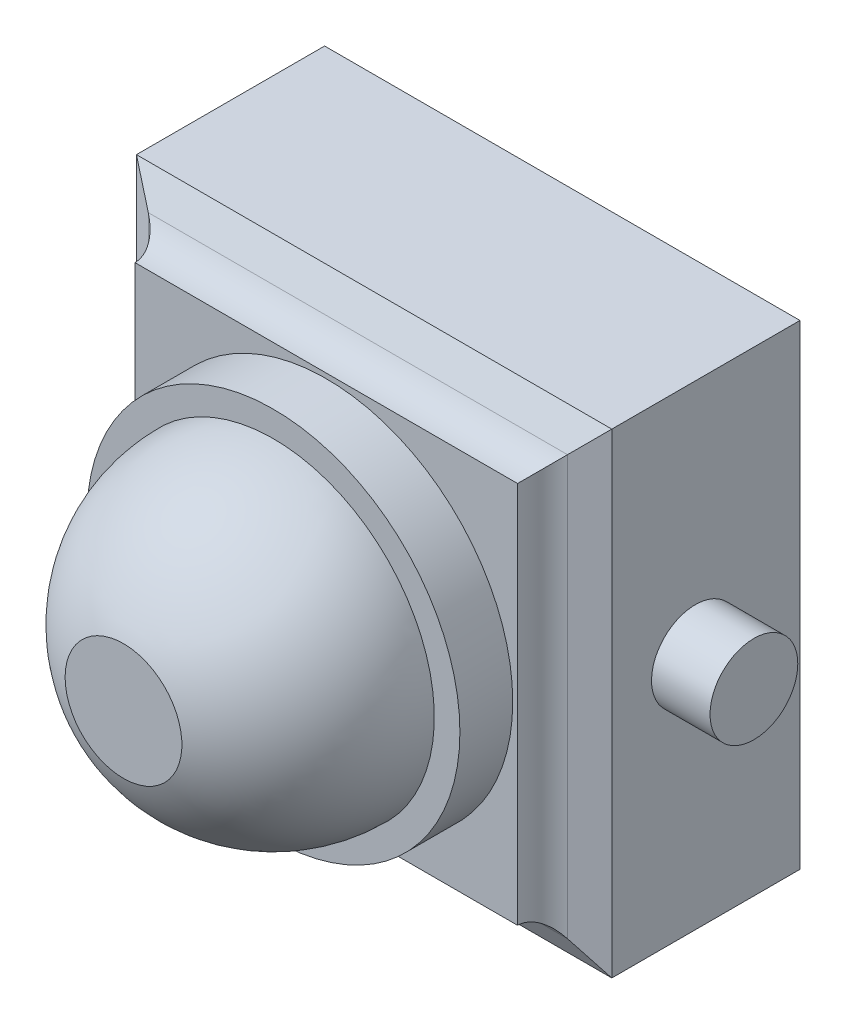
ISO-10303-21;
HEADER;
FILE_DESCRIPTION(('STEP AP214'),'2;1');
FILE_NAME('part.step','',(''),(''),'','','');
FILE_SCHEMA(('AUTOMOTIVE_DESIGN { 1 0 10303 214 1 1 1 1 }'));
ENDSEC;
DATA;
#1=APPLICATION_CONTEXT('core data for automotive mechanical design processes');
#2=APPLICATION_PROTOCOL_DEFINITION('international standard','automotive_design',2000,#1);
#3=PRODUCT_CONTEXT('',#1,'mechanical');
#4=PRODUCT('Part','Part','',(#3));
#5=PRODUCT_RELATED_PRODUCT_CATEGORY('part','',(#4));
#6=PRODUCT_DEFINITION_FORMATION('','',#4);
#7=PRODUCT_DEFINITION_CONTEXT('part definition',#1,'design');
#8=PRODUCT_DEFINITION('design','',#6,#7);
#9=PRODUCT_DEFINITION_SHAPE('','',#8);
#10=(LENGTH_UNIT() NAMED_UNIT(*) SI_UNIT(.MILLI.,.METRE.));
#11=(NAMED_UNIT(*) PLANE_ANGLE_UNIT() SI_UNIT($,.RADIAN.));
#12=(NAMED_UNIT(*) SI_UNIT($,.STERADIAN.) SOLID_ANGLE_UNIT());
#13=UNCERTAINTY_MEASURE_WITH_UNIT(LENGTH_MEASURE(1.E-05),#10,'distance_accuracy_value','');
#14=(GEOMETRIC_REPRESENTATION_CONTEXT(3) GLOBAL_UNCERTAINTY_ASSIGNED_CONTEXT((#13)) GLOBAL_UNIT_ASSIGNED_CONTEXT((#10,
#11,#12)) REPRESENTATION_CONTEXT('',''));
#15=CARTESIAN_POINT('',(0.,0.,0.));
#16=DIRECTION('',(0.,0.,1.));
#17=DIRECTION('',(1.,0.,0.));
#18=AXIS2_PLACEMENT_3D('',#15,#16,#17);
#19=CARTESIAN_POINT('',(0.,0.,39.5));
#20=DIRECTION('',(0.,1.,0.));
#21=DIRECTION('',(1.,0.,0.));
#22=AXIS2_PLACEMENT_3D('',#19,#20,#21);
#23=SPHERICAL_SURFACE('',#22,22.);
#24=CARTESIAN_POINT('',(0.,0.,39.5));
#25=DIRECTION('',(0.,0.,-1.));
#26=DIRECTION('',(-1.,0.,0.));
#27=AXIS2_PLACEMENT_3D('',#24,#25,#26);
#28=SPHERICAL_SURFACE('',#27,22.);
#29=CARTESIAN_POINT('',(0.,0.,60.));
#30=DIRECTION('',(0.,0.,-1.));
#31=DIRECTION('',(-1.,0.,0.));
#32=AXIS2_PLACEMENT_3D('',#29,#30,#31);
#33=CIRCLE('',#32,7.98435971133568);
#34=CARTESIAN_POINT('',(-7.98435971133567,0.,60.));
#35=VERTEX_POINT('',#34);
#36=EDGE_CURVE('E49',#35,#35,#33,.F.);
#37=ORIENTED_EDGE('',*,*,#36,.F.);
#38=EDGE_LOOP('',(#37));
#39=FACE_BOUND('',#38,.T.);
#40=CARTESIAN_POINT('',(0.,0.,39.5));
#41=DIRECTION('',(0.,0.,-1.));
#42=DIRECTION('',(-1.,0.,0.));
#43=AXIS2_PLACEMENT_3D('',#40,#41,#42);
#44=CIRCLE('',#43,22.);
#45=CARTESIAN_POINT('',(-22.,0.,39.4999999999999));
#46=VERTEX_POINT('',#45);
#47=EDGE_CURVE('E11',#46,#46,#44,.F.);
#48=ORIENTED_EDGE('',*,*,#47,.T.);
#49=EDGE_LOOP('',(#48));
#50=FACE_BOUND('',#49,.T.);
#51=ADVANCED_FACE('F46',(#39,#50),#28,.T.);
#52=CARTESIAN_POINT('',(0.,0.,39.5));
#53=DIRECTION('',(0.,0.,-1.));
#54=DIRECTION('',(-1.,0.,0.));
#55=AXIS2_PLACEMENT_3D('',#52,#53,#54);
#56=PLANE('',#55);
#57=ORIENTED_EDGE('',*,*,#47,.F.);
#58=EDGE_LOOP('',(#57));
#59=FACE_BOUND('',#58,.T.);
#60=ADVANCED_FACE('F61',(#59),#56,.T.);
#61=CARTESIAN_POINT('',(-9.99999999999998,-32.5,60.));
#62=DIRECTION('',(0.,0.,-1.));
#63=DIRECTION('',(-1.,0.,0.));
#64=AXIS2_PLACEMENT_3D('',#61,#62,#63);
#65=PLANE('',#64);
#66=ORIENTED_EDGE('',*,*,#36,.T.);
#67=EDGE_LOOP('',(#66));
#68=FACE_BOUND('',#67,.T.);
#69=ADVANCED_FACE('F58',(#68),#65,.F.);
#70=CLOSED_SHELL('',(#51,#60,#69));
#71=MANIFOLD_SOLID_BREP('B2',#70);
#72=CARTESIAN_POINT('',(32.5,32.5,39.5));
#73=DIRECTION('',(-1.,0.,0.));
#74=DIRECTION('',(0.,-1.,0.));
#75=AXIS2_PLACEMENT_3D('',#72,#73,#74);
#76=PLANE('',#75);
#77=CARTESIAN_POINT('',(32.5,0.,14.3));
#78=DIRECTION('',(-1.,0.,0.));
#79=DIRECTION('',(0.,-1.,0.));
#80=AXIS2_PLACEMENT_3D('',#77,#78,#79);
#81=CIRCLE('',#80,6.);
#82=CARTESIAN_POINT('',(32.5,-6.,14.3));
#83=VERTEX_POINT('',#82);
#84=EDGE_CURVE('E44',#83,#83,#81,.F.);
#85=ORIENTED_EDGE('',*,*,#84,.F.);
#86=EDGE_LOOP('',(#85));
#87=FACE_BOUND('',#86,.T.);
#88=DIRECTION('',(0.,1.,0.));
#89=VECTOR('',#88,1.);
#90=CARTESIAN_POINT('',(32.5000000000001,-32.501,25.73));
#91=LINE('',#90,#89);
#92=CARTESIAN_POINT('',(32.5,-32.5,25.73));
#93=VERTEX_POINT('',#92);
#94=CARTESIAN_POINT('',(32.4999999999999,32.5,25.73));
#95=VERTEX_POINT('',#94);
#96=EDGE_CURVE('E241',#93,#95,#91,.T.);
#97=ORIENTED_EDGE('',*,*,#96,.F.);
#98=DIRECTION('',(0.,0.,-1.));
#99=VECTOR('',#98,1.);
#100=CARTESIAN_POINT('',(32.5,-32.5,39.5));
#101=LINE('',#100,#99);
#102=CARTESIAN_POINT('',(32.5,-32.5,0.));
#103=VERTEX_POINT('',#102);
#104=EDGE_CURVE('E103',#93,#103,#101,.T.);
#105=ORIENTED_EDGE('',*,*,#104,.T.);
#106=DIRECTION('',(0.,1.,0.));
#107=VECTOR('',#106,1.);
#108=CARTESIAN_POINT('',(32.5,32.5,0.));
#109=LINE('',#108,#107);
#110=CARTESIAN_POINT('',(32.5,32.5,0.));
#111=VERTEX_POINT('',#110);
#112=EDGE_CURVE('E214',#103,#111,#109,.T.);
#113=ORIENTED_EDGE('',*,*,#112,.T.);
#114=DIRECTION('',(0.,0.,-1.));
#115=VECTOR('',#114,1.);
#116=CARTESIAN_POINT('',(32.5,32.5,39.5));
#117=LINE('',#116,#115);
#118=EDGE_CURVE('E96',#95,#111,#117,.T.);
#119=ORIENTED_EDGE('',*,*,#118,.F.);
#120=EDGE_LOOP('',(#97,#105,#113,#119));
#121=FACE_BOUND('',#120,.T.);
#122=ADVANCED_FACE('F89',(#87,#121),#76,.F.);
#123=CARTESIAN_POINT('',(-32.5,32.5,39.5));
#124=DIRECTION('',(1.,0.,0.));
#125=DIRECTION('',(0.,1.,0.));
#126=AXIS2_PLACEMENT_3D('',#123,#124,#125);
#127=PLANE('',#126);
#128=DIRECTION('',(0.,-1.,0.));
#129=VECTOR('',#128,1.);
#130=CARTESIAN_POINT('',(-32.4999999999999,32.5010000000003,25.73));
#131=LINE('',#130,#129);
#132=CARTESIAN_POINT('',(-32.5,32.5,25.73));
#133=VERTEX_POINT('',#132);
#134=CARTESIAN_POINT('',(-32.5,-32.5,25.73));
#135=VERTEX_POINT('',#134);
#136=EDGE_CURVE('E475',#133,#135,#131,.T.);
#137=ORIENTED_EDGE('',*,*,#136,.F.);
#138=DIRECTION('',(0.,0.,-1.));
#139=VECTOR('',#138,1.);
#140=CARTESIAN_POINT('',(-32.5,32.5,39.5));
#141=LINE('',#140,#139);
#142=CARTESIAN_POINT('',(-32.5,32.5,0.));
#143=VERTEX_POINT('',#142);
#144=EDGE_CURVE('E227',#133,#143,#141,.T.);
#145=ORIENTED_EDGE('',*,*,#144,.T.);
#146=DIRECTION('',(0.,-1.,0.));
#147=VECTOR('',#146,1.);
#148=CARTESIAN_POINT('',(-32.5,32.5,0.));
#149=LINE('',#148,#147);
#150=CARTESIAN_POINT('',(-32.5,-32.5,0.));
#151=VERTEX_POINT('',#150);
#152=EDGE_CURVE('E221',#143,#151,#149,.T.);
#153=ORIENTED_EDGE('',*,*,#152,.T.);
#154=DIRECTION('',(0.,0.,-1.));
#155=VECTOR('',#154,1.);
#156=CARTESIAN_POINT('',(-32.5,-32.5,39.5));
#157=LINE('',#156,#155);
#158=EDGE_CURVE('E110',#135,#151,#157,.T.);
#159=ORIENTED_EDGE('',*,*,#158,.F.);
#160=EDGE_LOOP('',(#137,#145,#153,#159));
#161=FACE_BOUND('',#160,.T.);
#162=ADVANCED_FACE('F244',(#161),#127,.F.);
#163=CARTESIAN_POINT('',(-32.501,-31.1602025479538,32.2768915517541));
#164=DIRECTION('',(1.,0.,0.));
#165=DIRECTION('',(0.,0.,-1.));
#166=AXIS2_PLACEMENT_3D('',#163,#164,#165);
#167=CYLINDRICAL_SURFACE('',#166,5.);
#168=DIRECTION('',(1.,0.,0.));
#169=VECTOR('',#168,1.);
#170=CARTESIAN_POINT('',(-32.501,-28.6603239717094,27.9466944310639));
#171=LINE('',#170,#169);
#172=CARTESIAN_POINT('',(-28.6603239717095,-28.6603239717094,27.9466944310639));
#173=VERTEX_POINT('',#172);
#174=CARTESIAN_POINT('',(28.6603239717095,-28.6603239717094,27.9466944310639));
#175=VERTEX_POINT('',#174);
#176=EDGE_CURVE('E184',#173,#175,#171,.T.);
#177=ORIENTED_EDGE('',*,*,#176,.T.);
#178=CARTESIAN_POINT('',(31.1602025479539,-31.1602025479538,32.2768915517541));
#179=DIRECTION('',(0.707106781186546,0.707106781186549,0.));
#180=DIRECTION('',(-0.707106781186549,0.707106781186546,0.));
#181=AXIS2_PLACEMENT_3D('',#178,#179,#180);
#182=ELLIPSE('',#181,7.07106781186549,5.);
#183=CARTESIAN_POINT('',(26.1602025499197,-26.1602025499196,32.2767513448132));
#184=VERTEX_POINT('',#183);
#185=EDGE_CURVE('E182',#184,#175,#182,.F.);
#186=ORIENTED_EDGE('',*,*,#185,.F.);
#187=DIRECTION('',(1.,0.,0.));
#188=VECTOR('',#187,1.);
#189=CARTESIAN_POINT('',(-32.501,-26.1602025499196,32.2767513448132));
#190=LINE('',#189,#188);
#191=CARTESIAN_POINT('',(-26.1602025499196,-26.1602025499195,32.2767513448132));
#192=VERTEX_POINT('',#191);
#193=EDGE_CURVE('E159',#192,#184,#190,.T.);
#194=ORIENTED_EDGE('',*,*,#193,.F.);
#195=CARTESIAN_POINT('',(-31.1602025479539,-31.1602025479538,32.2768915517541));
#196=DIRECTION('',(-0.707106781186546,0.707106781186549,0.));
#197=DIRECTION('',(0.707106781186549,0.707106781186546,0.));
#198=AXIS2_PLACEMENT_3D('',#195,#196,#197);
#199=ELLIPSE('',#198,7.07106781186549,5.);
#200=EDGE_CURVE('E169',#192,#173,#199,.T.);
#201=ORIENTED_EDGE('',*,*,#200,.T.);
#202=EDGE_LOOP('',(#177,#186,#194,#201));
#203=FACE_BOUND('',#202,.T.);
#204=ADVANCED_FACE('F180',(#203),#167,.F.);
#205=CARTESIAN_POINT('',(-32.501,-28.6603239717094,27.9466944310639));
#206=DIRECTION('',(0.,-0.499975715248886,0.86603942413805));
#207=DIRECTION('',(0.,-0.86603942413805,-0.499975715248886));
#208=AXIS2_PLACEMENT_3D('',#205,#206,#207);
#209=PLANE('',#208);
#210=DIRECTION('',(1.,0.,0.));
#211=VECTOR('',#210,1.);
#212=CARTESIAN_POINT('',(-32.501,-32.5,25.73));
#213=LINE('',#212,#211);
#214=EDGE_CURVE('E189',#135,#93,#213,.T.);
#215=ORIENTED_EDGE('',*,*,#214,.T.);
#216=DIRECTION('',(0.654659726868451,-0.654659726868449,-0.377943493174646));
#217=VECTOR('',#216,1.);
#218=CARTESIAN_POINT('',(30.3063584381368,-30.3063584381367,26.996417530569));
#219=LINE('',#218,#217);
#220=EDGE_CURVE('E488',#175,#93,#219,.T.);
#221=ORIENTED_EDGE('',*,*,#220,.F.);
#222=ORIENTED_EDGE('',*,*,#176,.F.);
#223=DIRECTION('',(-0.654659726868451,-0.654659726868449,-0.377943493174646));
#224=VECTOR('',#223,1.);
#225=CARTESIAN_POINT('',(-30.3063584381368,-30.3063584381367,26.996417530569));
#226=LINE('',#225,#224);
#227=EDGE_CURVE('E176',#173,#135,#226,.T.);
#228=ORIENTED_EDGE('',*,*,#227,.T.);
#229=EDGE_LOOP('',(#215,#221,#222,#228));
#230=FACE_BOUND('',#229,.T.);
#231=ADVANCED_FACE('F382',(#230),#209,.T.);
#232=CARTESIAN_POINT('',(-32.501,28.6603239717094,27.9466944310639));
#233=DIRECTION('',(0.,-0.499975715248886,-0.86603942413805));
#234=DIRECTION('',(0.,0.86603942413805,-0.499975715248886));
#235=AXIS2_PLACEMENT_3D('',#232,#233,#234);
#236=PLANE('',#235);
#237=DIRECTION('',(-0.654659726868448,-0.654659726868451,0.377943493174647));
#238=VECTOR('',#237,1.);
#239=CARTESIAN_POINT('',(30.3063584381367,30.3063584381368,26.9964175305689));
#240=LINE('',#239,#238);
#241=CARTESIAN_POINT('',(28.6603239717093,28.6603239717094,27.9466944310639));
#242=VERTEX_POINT('',#241);
#243=EDGE_CURVE('E500',#95,#242,#240,.T.);
#244=ORIENTED_EDGE('',*,*,#243,.F.);
#245=DIRECTION('',(1.,0.,0.));
#246=VECTOR('',#245,1.);
#247=CARTESIAN_POINT('',(-32.501,32.5,25.73));
#248=LINE('',#247,#246);
#249=EDGE_CURVE('E236',#133,#95,#248,.T.);
#250=ORIENTED_EDGE('',*,*,#249,.F.);
#251=DIRECTION('',(0.654659726868448,-0.654659726868451,0.377943493174647));
#252=VECTOR('',#251,1.);
#253=CARTESIAN_POINT('',(-30.3063584381367,30.3063584381368,26.9964175305689));
#254=LINE('',#253,#252);
#255=CARTESIAN_POINT('',(-28.6603239717093,28.6603239717094,27.9466944310639));
#256=VERTEX_POINT('',#255);
#257=EDGE_CURVE('E165',#133,#256,#254,.T.);
#258=ORIENTED_EDGE('',*,*,#257,.T.);
#259=DIRECTION('',(1.,0.,0.));
#260=VECTOR('',#259,1.);
#261=CARTESIAN_POINT('',(-32.501,28.6603239717094,27.9466944310639));
#262=LINE('',#261,#260);
#263=EDGE_CURVE('E482',#256,#242,#262,.T.);
#264=ORIENTED_EDGE('',*,*,#263,.T.);
#265=EDGE_LOOP('',(#244,#250,#258,#264));
#266=FACE_BOUND('',#265,.T.);
#267=ADVANCED_FACE('F387',(#266),#236,.F.);
#268=CARTESIAN_POINT('',(-32.501,31.1602025479538,32.2768915517541));
#269=DIRECTION('',(1.,0.,0.));
#270=DIRECTION('',(0.,0.,-1.));
#271=AXIS2_PLACEMENT_3D('',#268,#269,#270);
#272=CYLINDRICAL_SURFACE('',#271,5.);
#273=CARTESIAN_POINT('',(31.1602025479537,31.1602025479538,32.2768915517541));
#274=DIRECTION('',(0.707106781186549,-0.707106781186546,0.));
#275=DIRECTION('',(-0.707106781186546,-0.707106781186549,0.));
#276=AXIS2_PLACEMENT_3D('',#273,#274,#275);
#277=ELLIPSE('',#276,7.07106781186546,5.);
#278=CARTESIAN_POINT('',(26.1602025499195,26.1602025499196,32.2767513448132));
#279=VERTEX_POINT('',#278);
#280=EDGE_CURVE('E489',#242,#279,#277,.F.);
#281=ORIENTED_EDGE('',*,*,#280,.F.);
#282=ORIENTED_EDGE('',*,*,#263,.F.);
#283=CARTESIAN_POINT('',(-31.1602025479537,31.1602025479538,32.2768915517541));
#284=DIRECTION('',(-0.707106781186549,-0.707106781186546,0.));
#285=DIRECTION('',(0.707106781186546,-0.707106781186549,0.));
#286=AXIS2_PLACEMENT_3D('',#283,#284,#285);
#287=ELLIPSE('',#286,7.07106781186546,5.);
#288=CARTESIAN_POINT('',(-26.1602025499195,26.1602025499196,32.2767513448132));
#289=VERTEX_POINT('',#288);
#290=EDGE_CURVE('E478',#256,#289,#287,.T.);
#291=ORIENTED_EDGE('',*,*,#290,.T.);
#292=DIRECTION('',(1.,0.,0.));
#293=VECTOR('',#292,1.);
#294=CARTESIAN_POINT('',(-32.501,26.1602025499196,32.2767513448132));
#295=LINE('',#294,#293);
#296=EDGE_CURVE('E162',#289,#279,#295,.T.);
#297=ORIENTED_EDGE('',*,*,#296,.T.);
#298=EDGE_LOOP('',(#281,#282,#291,#297));
#299=FACE_BOUND('',#298,.T.);
#300=ADVANCED_FACE('F308',(#299),#272,.F.);
#301=CARTESIAN_POINT('',(-32.5,-32.5,39.5));
#302=DIRECTION('',(0.,1.,0.));
#303=DIRECTION('',(0.,0.,1.));
#304=AXIS2_PLACEMENT_3D('',#301,#302,#303);
#305=PLANE('',#304);
#306=ORIENTED_EDGE('',*,*,#214,.F.);
#307=ORIENTED_EDGE('',*,*,#158,.T.);
#308=DIRECTION('',(1.,0.,0.));
#309=VECTOR('',#308,1.);
#310=CARTESIAN_POINT('',(-32.5,-32.5,0.));
#311=LINE('',#310,#309);
#312=EDGE_CURVE('E223',#151,#103,#311,.T.);
#313=ORIENTED_EDGE('',*,*,#312,.T.);
#314=ORIENTED_EDGE('',*,*,#104,.F.);
#315=EDGE_LOOP('',(#306,#307,#313,#314));
#316=FACE_BOUND('',#315,.T.);
#317=ADVANCED_FACE('F306',(#316),#305,.F.);
#318=CARTESIAN_POINT('',(-32.5,32.5,39.5));
#319=DIRECTION('',(0.,-1.,0.));
#320=DIRECTION('',(0.,0.,-1.));
#321=AXIS2_PLACEMENT_3D('',#318,#319,#320);
#322=PLANE('',#321);
#323=ORIENTED_EDGE('',*,*,#144,.F.);
#324=ORIENTED_EDGE('',*,*,#249,.T.);
#325=ORIENTED_EDGE('',*,*,#118,.T.);
#326=DIRECTION('',(-1.,0.,0.));
#327=VECTOR('',#326,1.);
#328=CARTESIAN_POINT('',(-32.5,32.5,0.));
#329=LINE('',#328,#327);
#330=EDGE_CURVE('E218',#111,#143,#329,.T.);
#331=ORIENTED_EDGE('',*,*,#330,.T.);
#332=EDGE_LOOP('',(#323,#324,#325,#331));
#333=FACE_BOUND('',#332,.T.);
#334=ADVANCED_FACE('F233',(#333),#322,.F.);
#335=CARTESIAN_POINT('',(0.,0.,0.));
#336=DIRECTION('',(0.,0.,1.));
#337=DIRECTION('',(1.,0.,0.));
#338=AXIS2_PLACEMENT_3D('',#335,#336,#337);
#339=PLANE('',#338);
#340=CARTESIAN_POINT('',(-24.,18.,0.));
#341=DIRECTION('',(0.,0.,-1.));
#342=DIRECTION('',(1.,0.,0.));
#343=AXIS2_PLACEMENT_3D('',#340,#341,#342);
#344=CIRCLE('',#343,1.5);
#345=CARTESIAN_POINT('',(-22.5,18.,0.));
#346=VERTEX_POINT('',#345);
#347=EDGE_CURVE('E187',#346,#346,#344,.T.);
#348=ORIENTED_EDGE('',*,*,#347,.F.);
#349=EDGE_LOOP('',(#348));
#350=FACE_BOUND('',#349,.T.);
#351=CARTESIAN_POINT('',(24.,18.,0.));
#352=DIRECTION('',(0.,0.,-1.));
#353=DIRECTION('',(-1.,0.,0.));
#354=AXIS2_PLACEMENT_3D('',#351,#352,#353);
#355=CIRCLE('',#354,1.5);
#356=CARTESIAN_POINT('',(22.5,18.,0.));
#357=VERTEX_POINT('',#356);
#358=EDGE_CURVE('E203',#357,#357,#355,.T.);
#359=ORIENTED_EDGE('',*,*,#358,.F.);
#360=EDGE_LOOP('',(#359));
#361=FACE_BOUND('',#360,.T.);
#362=CARTESIAN_POINT('',(24.,-18.,0.));
#363=DIRECTION('',(0.,0.,-1.));
#364=DIRECTION('',(1.,0.,0.));
#365=AXIS2_PLACEMENT_3D('',#362,#363,#364);
#366=CIRCLE('',#365,1.5);
#367=CARTESIAN_POINT('',(25.5,-18.,0.));
#368=VERTEX_POINT('',#367);
#369=EDGE_CURVE('E197',#368,#368,#366,.T.);
#370=ORIENTED_EDGE('',*,*,#369,.F.);
#371=EDGE_LOOP('',(#370));
#372=FACE_BOUND('',#371,.T.);
#373=CARTESIAN_POINT('',(-24.,-18.,0.));
#374=DIRECTION('',(0.,0.,-1.));
#375=DIRECTION('',(-1.,0.,0.));
#376=AXIS2_PLACEMENT_3D('',#373,#374,#375);
#377=CIRCLE('',#376,1.5);
#378=CARTESIAN_POINT('',(-25.5,-18.,0.));
#379=VERTEX_POINT('',#378);
#380=EDGE_CURVE('E196',#379,#379,#377,.T.);
#381=ORIENTED_EDGE('',*,*,#380,.F.);
#382=EDGE_LOOP('',(#381));
#383=FACE_BOUND('',#382,.T.);
#384=ORIENTED_EDGE('',*,*,#112,.F.);
#385=ORIENTED_EDGE('',*,*,#312,.F.);
#386=ORIENTED_EDGE('',*,*,#152,.F.);
#387=ORIENTED_EDGE('',*,*,#330,.F.);
#388=EDGE_LOOP('',(#384,#385,#386,#387));
#389=FACE_BOUND('',#388,.T.);
#390=ADVANCED_FACE('F239',(#350,#361,#372,#383,#389),#339,.F.);
#391=CARTESIAN_POINT('',(-24.,-18.,5.));
#392=DIRECTION('',(0.,0.,-1.));
#393=DIRECTION('',(-1.,0.,0.));
#394=AXIS2_PLACEMENT_3D('',#391,#392,#393);
#395=CYLINDRICAL_SURFACE('',#394,1.5);
#396=CARTESIAN_POINT('',(-24.,-18.,5.));
#397=DIRECTION('',(0.,0.,-1.));
#398=DIRECTION('',(-1.,0.,0.));
#399=AXIS2_PLACEMENT_3D('',#396,#397,#398);
#400=CIRCLE('',#399,1.5);
#401=CARTESIAN_POINT('',(-25.5,-18.,5.));
#402=VERTEX_POINT('',#401);
#403=EDGE_CURVE('E211',#402,#402,#400,.T.);
#404=ORIENTED_EDGE('',*,*,#403,.F.);
#405=EDGE_LOOP('',(#404));
#406=FACE_BOUND('',#405,.T.);
#407=ORIENTED_EDGE('',*,*,#380,.T.);
#408=EDGE_LOOP('',(#407));
#409=FACE_BOUND('',#408,.T.);
#410=ADVANCED_FACE('F293',(#406,#409),#395,.F.);
#411=CARTESIAN_POINT('',(-24.,-18.,5.));
#412=DIRECTION('',(0.,0.,-1.));
#413=DIRECTION('',(-1.,0.,0.));
#414=AXIS2_PLACEMENT_3D('',#411,#412,#413);
#415=PLANE('',#414);
#416=ORIENTED_EDGE('',*,*,#403,.T.);
#417=EDGE_LOOP('',(#416));
#418=FACE_BOUND('',#417,.T.);
#419=ADVANCED_FACE('F279',(#418),#415,.T.);
#420=CARTESIAN_POINT('',(24.,-18.,5.));
#421=DIRECTION('',(0.,0.,-1.));
#422=DIRECTION('',(-1.,0.,0.));
#423=AXIS2_PLACEMENT_3D('',#420,#421,#422);
#424=CYLINDRICAL_SURFACE('',#423,1.5);
#425=CARTESIAN_POINT('',(24.,-18.,5.));
#426=DIRECTION('',(0.,0.,-1.));
#427=DIRECTION('',(1.,0.,0.));
#428=AXIS2_PLACEMENT_3D('',#425,#426,#427);
#429=CIRCLE('',#428,1.5);
#430=CARTESIAN_POINT('',(25.5,-18.,5.));
#431=VERTEX_POINT('',#430);
#432=EDGE_CURVE('E193',#431,#431,#429,.T.);
#433=ORIENTED_EDGE('',*,*,#432,.F.);
#434=EDGE_LOOP('',(#433));
#435=FACE_BOUND('',#434,.T.);
#436=ORIENTED_EDGE('',*,*,#369,.T.);
#437=EDGE_LOOP('',(#436));
#438=FACE_BOUND('',#437,.T.);
#439=ADVANCED_FACE('F275',(#435,#438),#424,.F.);
#440=CARTESIAN_POINT('',(24.,-18.,5.));
#441=DIRECTION('',(0.,0.,1.));
#442=DIRECTION('',(1.,0.,0.));
#443=AXIS2_PLACEMENT_3D('',#440,#441,#442);
#444=PLANE('',#443);
#445=ORIENTED_EDGE('',*,*,#432,.T.);
#446=EDGE_LOOP('',(#445));
#447=FACE_BOUND('',#446,.T.);
#448=ADVANCED_FACE('F271',(#447),#444,.F.);
#449=CARTESIAN_POINT('',(24.,18.,5.));
#450=DIRECTION('',(0.,0.,-1.));
#451=DIRECTION('',(-1.,0.,0.));
#452=AXIS2_PLACEMENT_3D('',#449,#450,#451);
#453=CYLINDRICAL_SURFACE('',#452,1.5);
#454=CARTESIAN_POINT('',(24.,18.,5.));
#455=DIRECTION('',(0.,0.,-1.));
#456=DIRECTION('',(-1.,0.,0.));
#457=AXIS2_PLACEMENT_3D('',#454,#455,#456);
#458=CIRCLE('',#457,1.5);
#459=CARTESIAN_POINT('',(22.5,18.,5.));
#460=VERTEX_POINT('',#459);
#461=EDGE_CURVE('E200',#460,#460,#458,.T.);
#462=ORIENTED_EDGE('',*,*,#461,.F.);
#463=EDGE_LOOP('',(#462));
#464=FACE_BOUND('',#463,.T.);
#465=ORIENTED_EDGE('',*,*,#358,.T.);
#466=EDGE_LOOP('',(#465));
#467=FACE_BOUND('',#466,.T.);
#468=ADVANCED_FACE('F274',(#464,#467),#453,.F.);
#469=CARTESIAN_POINT('',(24.,18.,5.));
#470=DIRECTION('',(0.,0.,-1.));
#471=DIRECTION('',(-1.,0.,0.));
#472=AXIS2_PLACEMENT_3D('',#469,#470,#471);
#473=PLANE('',#472);
#474=ORIENTED_EDGE('',*,*,#461,.T.);
#475=EDGE_LOOP('',(#474));
#476=FACE_BOUND('',#475,.T.);
#477=ADVANCED_FACE('F281',(#476),#473,.T.);
#478=CARTESIAN_POINT('',(-24.,18.,5.));
#479=DIRECTION('',(0.,0.,-1.));
#480=DIRECTION('',(-1.,0.,0.));
#481=AXIS2_PLACEMENT_3D('',#478,#479,#480);
#482=CYLINDRICAL_SURFACE('',#481,1.5);
#483=CARTESIAN_POINT('',(-24.,18.,5.));
#484=DIRECTION('',(0.,0.,-1.));
#485=DIRECTION('',(1.,0.,0.));
#486=AXIS2_PLACEMENT_3D('',#483,#484,#485);
#487=CIRCLE('',#486,1.5);
#488=CARTESIAN_POINT('',(-22.5,18.,5.));
#489=VERTEX_POINT('',#488);
#490=EDGE_CURVE('E206',#489,#489,#487,.T.);
#491=ORIENTED_EDGE('',*,*,#490,.F.);
#492=EDGE_LOOP('',(#491));
#493=FACE_BOUND('',#492,.T.);
#494=ORIENTED_EDGE('',*,*,#347,.T.);
#495=EDGE_LOOP('',(#494));
#496=FACE_BOUND('',#495,.T.);
#497=ADVANCED_FACE('F265',(#493,#496),#482,.F.);
#498=CARTESIAN_POINT('',(-24.,18.,5.));
#499=DIRECTION('',(0.,0.,1.));
#500=DIRECTION('',(1.,0.,0.));
#501=AXIS2_PLACEMENT_3D('',#498,#499,#500);
#502=PLANE('',#501);
#503=ORIENTED_EDGE('',*,*,#490,.T.);
#504=EDGE_LOOP('',(#503));
#505=FACE_BOUND('',#504,.T.);
#506=ADVANCED_FACE('F256',(#505),#502,.F.);
#507=CARTESIAN_POINT('',(40.5,0.,14.3));
#508=DIRECTION('',(-1.,0.,0.));
#509=DIRECTION('',(0.,-1.,0.));
#510=AXIS2_PLACEMENT_3D('',#507,#508,#509);
#511=CYLINDRICAL_SURFACE('',#510,6.);
#512=CARTESIAN_POINT('',(40.5,0.,14.3));
#513=DIRECTION('',(1.,0.,0.));
#514=DIRECTION('',(0.,1.,0.));
#515=AXIS2_PLACEMENT_3D('',#512,#513,#514);
#516=CIRCLE('',#515,6.);
#517=CARTESIAN_POINT('',(40.5,6.00000000000001,14.3));
#518=VERTEX_POINT('',#517);
#519=EDGE_CURVE('E183',#518,#518,#516,.T.);
#520=ORIENTED_EDGE('',*,*,#519,.F.);
#521=EDGE_LOOP('',(#520));
#522=FACE_BOUND('',#521,.T.);
#523=ORIENTED_EDGE('',*,*,#84,.T.);
#524=EDGE_LOOP('',(#523));
#525=FACE_BOUND('',#524,.T.);
#526=ADVANCED_FACE('F253',(#522,#525),#511,.T.);
#527=CARTESIAN_POINT('',(40.5,0.,14.3));
#528=DIRECTION('',(1.,0.,0.));
#529=DIRECTION('',(0.,1.,0.));
#530=AXIS2_PLACEMENT_3D('',#527,#528,#529);
#531=PLANE('',#530);
#532=ORIENTED_EDGE('',*,*,#519,.T.);
#533=EDGE_LOOP('',(#532));
#534=FACE_BOUND('',#533,.T.);
#535=ADVANCED_FACE('F255',(#534),#531,.T.);
#536=CARTESIAN_POINT('',(-31.1602025479537,32.5010000000003,32.2768915517541));
#537=DIRECTION('',(0.,-1.,0.));
#538=DIRECTION('',(1.,0.,0.));
#539=AXIS2_PLACEMENT_3D('',#536,#537,#538);
#540=CYLINDRICAL_SURFACE('',#539,5.);
#541=DIRECTION('',(0.,-1.,0.));
#542=VECTOR('',#541,1.);
#543=CARTESIAN_POINT('',(-28.6603239717093,32.5010000000002,27.9466944310639));
#544=LINE('',#543,#542);
#545=EDGE_CURVE('E166',#256,#173,#544,.T.);
#546=ORIENTED_EDGE('',*,*,#545,.T.);
#547=ORIENTED_EDGE('',*,*,#200,.F.);
#548=DIRECTION('',(0.,-1.,0.));
#549=VECTOR('',#548,1.);
#550=CARTESIAN_POINT('',(-26.1602025499195,32.5010000000002,32.2767513448132));
#551=LINE('',#550,#549);
#552=EDGE_CURVE('E155',#289,#192,#551,.T.);
#553=ORIENTED_EDGE('',*,*,#552,.F.);
#554=ORIENTED_EDGE('',*,*,#290,.F.);
#555=EDGE_LOOP('',(#546,#547,#553,#554));
#556=FACE_BOUND('',#555,.T.);
#557=ADVANCED_FACE('F170',(#556),#540,.F.);
#558=CARTESIAN_POINT('',(-28.6603239717093,32.5010000000002,27.9466944310639));
#559=DIRECTION('',(-0.499975715248886,0.,0.86603942413805));
#560=DIRECTION('',(0.86603942413805,0.,0.499975715248886));
#561=AXIS2_PLACEMENT_3D('',#558,#559,#560);
#562=PLANE('',#561);
#563=ORIENTED_EDGE('',*,*,#136,.T.);
#564=ORIENTED_EDGE('',*,*,#227,.F.);
#565=ORIENTED_EDGE('',*,*,#545,.F.);
#566=ORIENTED_EDGE('',*,*,#257,.F.);
#567=EDGE_LOOP('',(#563,#564,#565,#566));
#568=FACE_BOUND('',#567,.T.);
#569=ADVANCED_FACE('F418',(#568),#562,.T.);
#570=CARTESIAN_POINT('',(31.1602025479539,-32.501,32.2768915517541));
#571=DIRECTION('',(0.,1.,0.));
#572=DIRECTION('',(-1.,0.,0.));
#573=AXIS2_PLACEMENT_3D('',#570,#571,#572);
#574=CYLINDRICAL_SURFACE('',#573,5.);
#575=ORIENTED_EDGE('',*,*,#185,.T.);
#576=DIRECTION('',(0.,1.,0.));
#577=VECTOR('',#576,1.);
#578=CARTESIAN_POINT('',(28.6603239717095,-32.501,27.9466944310639));
#579=LINE('',#578,#577);
#580=EDGE_CURVE('E496',#175,#242,#579,.T.);
#581=ORIENTED_EDGE('',*,*,#580,.T.);
#582=ORIENTED_EDGE('',*,*,#280,.T.);
#583=DIRECTION('',(0.,1.,0.));
#584=VECTOR('',#583,1.);
#585=CARTESIAN_POINT('',(26.1602025499197,-32.5010000000001,32.2767513448132));
#586=LINE('',#585,#584);
#587=EDGE_CURVE('E494',#184,#279,#586,.T.);
#588=ORIENTED_EDGE('',*,*,#587,.F.);
#589=EDGE_LOOP('',(#575,#581,#582,#588));
#590=FACE_BOUND('',#589,.T.);
#591=ADVANCED_FACE('F425',(#590),#574,.F.);
#592=CARTESIAN_POINT('',(28.6603239717095,-32.501,27.9466944310639));
#593=DIRECTION('',(0.499975715248886,0.,0.86603942413805));
#594=DIRECTION('',(0.86603942413805,0.,-0.499975715248886));
#595=AXIS2_PLACEMENT_3D('',#592,#593,#594);
#596=PLANE('',#595);
#597=ORIENTED_EDGE('',*,*,#220,.T.);
#598=ORIENTED_EDGE('',*,*,#96,.T.);
#599=ORIENTED_EDGE('',*,*,#243,.T.);
#600=ORIENTED_EDGE('',*,*,#580,.F.);
#601=EDGE_LOOP('',(#597,#598,#599,#600));
#602=FACE_BOUND('',#601,.T.);
#603=ADVANCED_FACE('F430',(#602),#596,.T.);
#604=CARTESIAN_POINT('',(0.,0.,32.2767513448132));
#605=DIRECTION('',(0.,0.,1.));
#606=DIRECTION('',(1.,0.,0.));
#607=AXIS2_PLACEMENT_3D('',#604,#605,#606);
#608=PLANE('',#607);
#609=CARTESIAN_POINT('',(0.,0.,32.2767513448132));
#610=DIRECTION('',(0.,0.,1.));
#611=DIRECTION('',(1.,0.,0.));
#612=AXIS2_PLACEMENT_3D('',#609,#610,#611);
#613=CIRCLE('',#612,25.5);
#614=CARTESIAN_POINT('',(25.5,0.,32.2767513448132));
#615=VERTEX_POINT('',#614);
#616=EDGE_CURVE('E177',#615,#615,#613,.T.);
#617=ORIENTED_EDGE('',*,*,#616,.F.);
#618=EDGE_LOOP('',(#617));
#619=FACE_BOUND('',#618,.T.);
#620=ORIENTED_EDGE('',*,*,#552,.T.);
#621=ORIENTED_EDGE('',*,*,#193,.T.);
#622=ORIENTED_EDGE('',*,*,#587,.T.);
#623=ORIENTED_EDGE('',*,*,#296,.F.);
#624=EDGE_LOOP('',(#620,#621,#622,#623));
#625=FACE_BOUND('',#624,.T.);
#626=ADVANCED_FACE('F157',(#619,#625),#608,.T.);
#627=CARTESIAN_POINT('',(0.,0.,32.2767513448132));
#628=DIRECTION('',(0.,0.,1.));
#629=DIRECTION('',(1.,0.,0.));
#630=AXIS2_PLACEMENT_3D('',#627,#628,#629);
#631=CYLINDRICAL_SURFACE('',#630,25.5);
#632=CARTESIAN_POINT('',(0.,0.,39.5));
#633=DIRECTION('',(0.,0.,1.));
#634=DIRECTION('',(1.,0.,0.));
#635=AXIS2_PLACEMENT_3D('',#632,#633,#634);
#636=CIRCLE('',#635,25.5);
#637=CARTESIAN_POINT('',(25.5,0.,39.5));
#638=VERTEX_POINT('',#637);
#639=EDGE_CURVE('E505',#638,#638,#636,.T.);
#640=CARTESIAN_POINT('',(25.5,0.,32.2767513448132));
#641=CARTESIAN_POINT('',(25.5,0.,32.3519935183047));
#642=CARTESIAN_POINT('',(25.5,0.,32.4272356917963));
#643=CARTESIAN_POINT('',(25.5,0.,32.5777200387793));
#644=CARTESIAN_POINT('',(25.5,0.,32.6529622122709));
#645=CARTESIAN_POINT('',(25.5,0.,32.8034465592539));
#646=CARTESIAN_POINT('',(25.5,0.,32.8786887327454));
#647=CARTESIAN_POINT('',(25.5,0.,33.0291730797285));
#648=CARTESIAN_POINT('',(25.5,0.,33.10441525322));
#649=CARTESIAN_POINT('',(25.5,0.,33.2548996002031));
#650=CARTESIAN_POINT('',(25.5,0.,33.3301417736946));
#651=CARTESIAN_POINT('',(25.5,0.,33.4806261206777));
#652=CARTESIAN_POINT('',(25.5,0.,33.5558682941692));
#653=CARTESIAN_POINT('',(25.5,0.,33.7063526411523));
#654=CARTESIAN_POINT('',(25.5,0.,33.7815948146438));
#655=CARTESIAN_POINT('',(25.5,0.,33.9320791616268));
#656=CARTESIAN_POINT('',(25.5,0.,34.0073213351184));
#657=CARTESIAN_POINT('',(25.5,0.,34.1578056821014));
#658=CARTESIAN_POINT('',(25.5,0.,34.233047855593));
#659=CARTESIAN_POINT('',(25.5,0.,34.383532202576));
#660=CARTESIAN_POINT('',(25.5,0.,34.4587743760675));
#661=CARTESIAN_POINT('',(25.5,0.,34.6092587230506));
#662=CARTESIAN_POINT('',(25.5,0.,34.6845008965421));
#663=CARTESIAN_POINT('',(25.5,0.,34.8349852435252));
#664=CARTESIAN_POINT('',(25.5,0.,34.9102274170167));
#665=CARTESIAN_POINT('',(25.5,0.,35.0607117639998));
#666=CARTESIAN_POINT('',(25.5,0.,35.1359539374913));
#667=CARTESIAN_POINT('',(25.5,0.,35.2864382844744));
#668=CARTESIAN_POINT('',(25.5,0.,35.3616804579659));
#669=CARTESIAN_POINT('',(25.5,0.,35.512164804949));
#670=CARTESIAN_POINT('',(25.5,0.,35.5874069784405));
#671=CARTESIAN_POINT('',(25.5,0.,35.7378913254235));
#672=CARTESIAN_POINT('',(25.5,0.,35.8131334989151));
#673=CARTESIAN_POINT('',(25.5,0.,35.9636178458981));
#674=CARTESIAN_POINT('',(25.5,0.,36.0388600193897));
#675=CARTESIAN_POINT('',(25.5,0.,36.1893443663727));
#676=CARTESIAN_POINT('',(25.5,0.,36.2645865398642));
#677=CARTESIAN_POINT('',(25.5,0.,36.4150708868473));
#678=CARTESIAN_POINT('',(25.5,0.,36.4903130603388));
#679=CARTESIAN_POINT('',(25.5,0.,36.6407974073219));
#680=CARTESIAN_POINT('',(25.5,0.,36.7160395808134));
#681=CARTESIAN_POINT('',(25.5,0.,36.8665239277965));
#682=CARTESIAN_POINT('',(25.5,0.,36.941766101288));
#683=CARTESIAN_POINT('',(25.5,0.,37.0922504482711));
#684=CARTESIAN_POINT('',(25.5,0.,37.1674926217626));
#685=CARTESIAN_POINT('',(25.5,0.,37.3179769687457));
#686=CARTESIAN_POINT('',(25.5,0.,37.3932191422372));
#687=CARTESIAN_POINT('',(25.5,0.,37.5437034892202));
#688=CARTESIAN_POINT('',(25.5,0.,37.6189456627118));
#689=CARTESIAN_POINT('',(25.5,0.,37.7694300096948));
#690=CARTESIAN_POINT('',(25.5,0.,37.8446721831864));
#691=CARTESIAN_POINT('',(25.5,0.,37.9951565301694));
#692=CARTESIAN_POINT('',(25.5,0.,38.0703987036609));
#693=CARTESIAN_POINT('',(25.5,0.,38.220883050644));
#694=CARTESIAN_POINT('',(25.5,0.,38.2961252241355));
#695=CARTESIAN_POINT('',(25.5,0.,38.4466095711186));
#696=CARTESIAN_POINT('',(25.5,0.,38.5218517446101));
#697=CARTESIAN_POINT('',(25.5,0.,38.6723360915932));
#698=CARTESIAN_POINT('',(25.5,0.,38.7475782650847));
#699=CARTESIAN_POINT('',(25.5,0.,38.8980626120678));
#700=CARTESIAN_POINT('',(25.5,0.,38.9733047855593));
#701=CARTESIAN_POINT('',(25.5,0.,39.1237891325423));
#702=CARTESIAN_POINT('',(25.5,0.,39.1990313060339));
#703=CARTESIAN_POINT('',(25.5,0.,39.3495156530169));
#704=CARTESIAN_POINT('',(25.5,0.,39.4247578265085));
#705=CARTESIAN_POINT('',(25.5,0.,39.5));
#706=B_SPLINE_CURVE_WITH_KNOTS('',3,(#640,#641,#642,#643,#644,#645,#646,#647,#648,#649,#650,
#651,#652,#653,#654,#655,#656,#657,#658,#659,#660,#661,#662,#663,#664,#665,#666,#667,#668,#669,
#670,#671,#672,#673,#674,#675,#676,#677,#678,#679,#680,#681,#682,#683,#684,#685,#686,#687,#688,
#689,#690,#691,#692,#693,#694,#695,#696,#697,#698,#699,#700,#701,#702,#703,#704,#705),
.UNSPECIFIED.,.F.,.F.,(4,2,2,2,2,2,2,2,2,2,2,2,2,2,2,2,2,2,2,2,2,2,2,2,2,2,2,2,2,2,2,2,4),(0.,
0.22572652047459,0.451453040949179,0.677179561423769,0.902906081898351,1.12863260237294,
1.35435912284753,1.58008564332211,1.8058121637967,2.03153868427129,2.25726520474587,
2.48299172522046,2.70871824569505,2.93444476616964,3.16017128664423,3.38589780711882,
3.6116243275934,3.83735084806799,4.06307736854258,4.28880388901717,4.51453040949175,
4.74025692996634,4.96598345044093,5.19170997091551,5.4174364913901,5.64316301186469,
5.86888953233927,6.09461605281386,6.32034257328845,6.54606909376304,6.77179561423762,
6.99752213471221,7.2232486551868),.UNSPECIFIED.);
#707=EDGE_CURVE('BSEAM301',#615,#638,#706,.T.);
#708=ORIENTED_EDGE('',*,*,#616,.T.);
#709=ORIENTED_EDGE('',*,*,#639,.F.);
#710=ORIENTED_EDGE('',*,*,#707,.T.);
#711=ORIENTED_EDGE('',*,*,#707,.F.);
#712=EDGE_LOOP('',(#708,#710,#709,#711));
#713=FACE_BOUND('',#712,.T.);
#714=ADVANCED_FACE('F301',(#713),#631,.T.);
#715=CARTESIAN_POINT('',(0.,0.,39.5));
#716=DIRECTION('',(0.,0.,1.));
#717=DIRECTION('',(1.,0.,0.));
#718=AXIS2_PLACEMENT_3D('',#715,#716,#717);
#719=PLANE('',#718);
#720=ORIENTED_EDGE('',*,*,#639,.T.);
#721=EDGE_LOOP('',(#720));
#722=FACE_BOUND('',#721,.T.);
#723=ADVANCED_FACE('F298',(#722),#719,.T.);
#724=CLOSED_SHELL('',(#122,#162,#204,#231,#267,#300,#317,#334,#390,#410,#419,#439,#448,#468,
#477,#497,#506,#526,#535,#557,#569,#591,#603,#626,#714,#723));
#725=MANIFOLD_SOLID_BREP('B6',#724);
#726=ADVANCED_BREP_SHAPE_REPRESENTATION('',(#18,#71,#725),#14);
#727=SHAPE_DEFINITION_REPRESENTATION(#9,#726);
ENDSEC;
END-ISO-10303-21;
